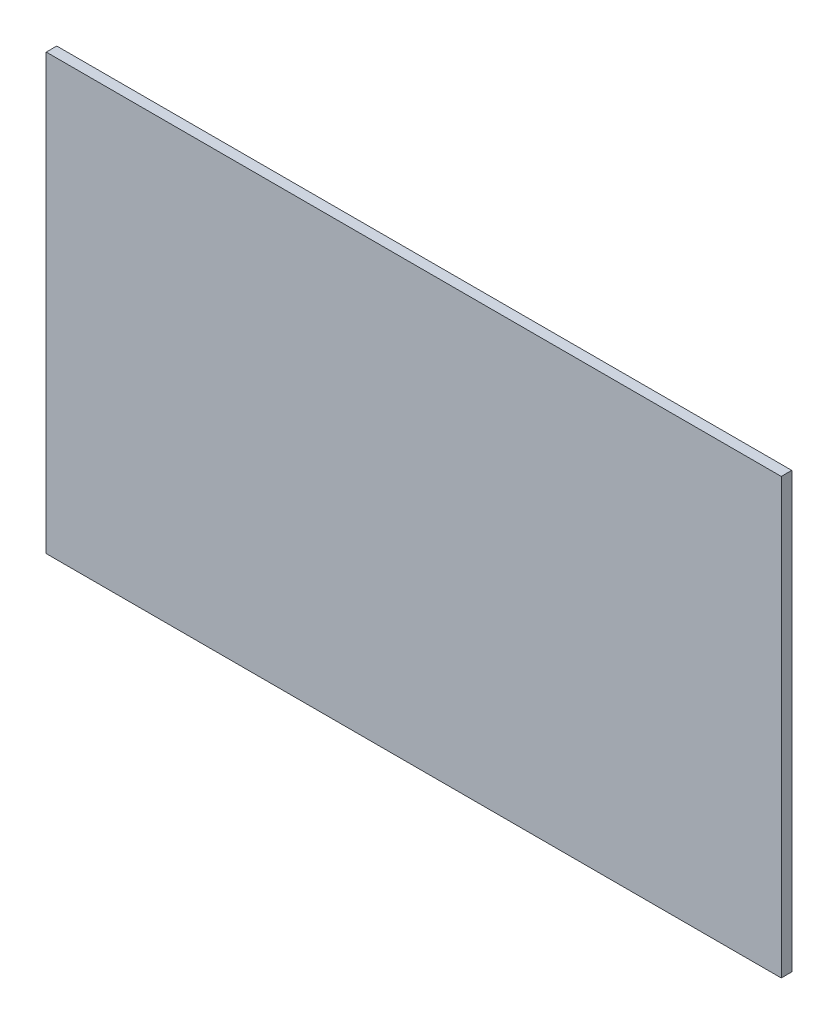
ISO-10303-21;
HEADER;
FILE_DESCRIPTION(('STEP AP214'),'2;1');
FILE_NAME('part.step','',(''),(''),'','','');
FILE_SCHEMA(('AUTOMOTIVE_DESIGN { 1 0 10303 214 1 1 1 1 }'));
ENDSEC;
DATA;
#1=APPLICATION_CONTEXT('core data for automotive mechanical design processes');
#2=APPLICATION_PROTOCOL_DEFINITION('international standard','automotive_design',2000,#1);
#3=PRODUCT_CONTEXT('',#1,'mechanical');
#4=PRODUCT('Part','Part','',(#3));
#5=PRODUCT_RELATED_PRODUCT_CATEGORY('part','',(#4));
#6=PRODUCT_DEFINITION_FORMATION('','',#4);
#7=PRODUCT_DEFINITION_CONTEXT('part definition',#1,'design');
#8=PRODUCT_DEFINITION('design','',#6,#7);
#9=PRODUCT_DEFINITION_SHAPE('','',#8);
#10=(LENGTH_UNIT() NAMED_UNIT(*) SI_UNIT(.MILLI.,.METRE.));
#11=(NAMED_UNIT(*) PLANE_ANGLE_UNIT() SI_UNIT($,.RADIAN.));
#12=(NAMED_UNIT(*) SI_UNIT($,.STERADIAN.) SOLID_ANGLE_UNIT());
#13=UNCERTAINTY_MEASURE_WITH_UNIT(LENGTH_MEASURE(1.E-05),#10,'distance_accuracy_value','');
#14=(GEOMETRIC_REPRESENTATION_CONTEXT(3) GLOBAL_UNCERTAINTY_ASSIGNED_CONTEXT((#13)) GLOBAL_UNIT_ASSIGNED_CONTEXT((#10,
#11,#12)) REPRESENTATION_CONTEXT('',''));
#15=CARTESIAN_POINT('',(0.,0.,0.));
#16=DIRECTION('',(0.,0.,1.));
#17=DIRECTION('',(1.,0.,0.));
#18=AXIS2_PLACEMENT_3D('',#15,#16,#17);
#19=CARTESIAN_POINT('',(88.9,52.5399,2.54));
#20=DIRECTION('',(-1.,0.,0.));
#21=DIRECTION('',(0.,0.,1.));
#22=AXIS2_PLACEMENT_3D('',#19,#20,#21);
#23=PLANE('',#22);
#24=DIRECTION('',(0.,1.,0.));
#25=VECTOR('',#24,1.);
#26=CARTESIAN_POINT('',(88.9,52.5399,0.));
#27=LINE('',#26,#25);
#28=CARTESIAN_POINT('',(88.9,-52.5399,0.));
#29=VERTEX_POINT('',#28);
#30=CARTESIAN_POINT('',(88.9,52.5399,0.));
#31=VERTEX_POINT('',#30);
#32=EDGE_CURVE('E107',#29,#31,#27,.T.);
#33=ORIENTED_EDGE('',*,*,#32,.T.);
#34=DIRECTION('',(0.,0.,-1.));
#35=VECTOR('',#34,1.);
#36=CARTESIAN_POINT('',(88.9,52.5399,2.54));
#37=LINE('',#36,#35);
#38=CARTESIAN_POINT('',(88.9,52.5399,2.54));
#39=VERTEX_POINT('',#38);
#40=EDGE_CURVE('E11',#39,#31,#37,.T.);
#41=ORIENTED_EDGE('',*,*,#40,.F.);
#42=DIRECTION('',(0.,1.,0.));
#43=VECTOR('',#42,1.);
#44=CARTESIAN_POINT('',(88.9,52.5399,2.54));
#45=LINE('',#44,#43);
#46=CARTESIAN_POINT('',(88.9,-52.5399,2.54));
#47=VERTEX_POINT('',#46);
#48=EDGE_CURVE('E91',#47,#39,#45,.T.);
#49=ORIENTED_EDGE('',*,*,#48,.F.);
#50=DIRECTION('',(0.,0.,-1.));
#51=VECTOR('',#50,1.);
#52=CARTESIAN_POINT('',(88.9,-52.5399,2.54));
#53=LINE('',#52,#51);
#54=EDGE_CURVE('E103',#47,#29,#53,.T.);
#55=ORIENTED_EDGE('',*,*,#54,.T.);
#56=EDGE_LOOP('',(#33,#41,#49,#55));
#57=FACE_BOUND('',#56,.T.);
#58=ADVANCED_FACE('F39',(#57),#23,.F.);
#59=CARTESIAN_POINT('',(-88.9,52.5399,2.54));
#60=DIRECTION('',(0.,-1.,0.));
#61=DIRECTION('',(1.,0.,0.));
#62=AXIS2_PLACEMENT_3D('',#59,#60,#61);
#63=PLANE('',#62);
#64=DIRECTION('',(-1.,0.,0.));
#65=VECTOR('',#64,1.);
#66=CARTESIAN_POINT('',(-88.9,52.5399,0.));
#67=LINE('',#66,#65);
#68=CARTESIAN_POINT('',(-88.9,52.5399,0.));
#69=VERTEX_POINT('',#68);
#70=EDGE_CURVE('E96',#31,#69,#67,.T.);
#71=ORIENTED_EDGE('',*,*,#70,.T.);
#72=DIRECTION('',(0.,0.,-1.));
#73=VECTOR('',#72,1.);
#74=CARTESIAN_POINT('',(-88.9,52.5399,2.54));
#75=LINE('',#74,#73);
#76=CARTESIAN_POINT('',(-88.9,52.5399,2.54));
#77=VERTEX_POINT('',#76);
#78=EDGE_CURVE('E48',#77,#69,#75,.T.);
#79=ORIENTED_EDGE('',*,*,#78,.F.);
#80=DIRECTION('',(-1.,0.,0.));
#81=VECTOR('',#80,1.);
#82=CARTESIAN_POINT('',(-88.9,52.5399,2.54));
#83=LINE('',#82,#81);
#84=EDGE_CURVE('E86',#39,#77,#83,.T.);
#85=ORIENTED_EDGE('',*,*,#84,.F.);
#86=ORIENTED_EDGE('',*,*,#40,.T.);
#87=EDGE_LOOP('',(#71,#79,#85,#86));
#88=FACE_BOUND('',#87,.T.);
#89=ADVANCED_FACE('F95',(#88),#63,.F.);
#90=CARTESIAN_POINT('',(-88.9,52.5399,2.54));
#91=DIRECTION('',(1.,0.,0.));
#92=DIRECTION('',(0.,1.,0.));
#93=AXIS2_PLACEMENT_3D('',#90,#91,#92);
#94=PLANE('',#93);
#95=DIRECTION('',(0.,-1.,0.));
#96=VECTOR('',#95,1.);
#97=CARTESIAN_POINT('',(-88.9,52.5399,0.));
#98=LINE('',#97,#96);
#99=CARTESIAN_POINT('',(-88.8999999999999,-52.5399,0.));
#100=VERTEX_POINT('',#99);
#101=EDGE_CURVE('E73',#69,#100,#98,.T.);
#102=ORIENTED_EDGE('',*,*,#101,.T.);
#103=DIRECTION('',(0.,0.,-1.));
#104=VECTOR('',#103,1.);
#105=CARTESIAN_POINT('',(-88.8999999999999,-52.5399,2.54));
#106=LINE('',#105,#104);
#107=CARTESIAN_POINT('',(-88.8999999999999,-52.5399,2.54));
#108=VERTEX_POINT('',#107);
#109=EDGE_CURVE('E98',#108,#100,#106,.T.);
#110=ORIENTED_EDGE('',*,*,#109,.F.);
#111=DIRECTION('',(0.,-1.,0.));
#112=VECTOR('',#111,1.);
#113=CARTESIAN_POINT('',(-88.9,52.5399,2.54));
#114=LINE('',#113,#112);
#115=EDGE_CURVE('E89',#77,#108,#114,.T.);
#116=ORIENTED_EDGE('',*,*,#115,.F.);
#117=ORIENTED_EDGE('',*,*,#78,.T.);
#118=EDGE_LOOP('',(#102,#110,#116,#117));
#119=FACE_BOUND('',#118,.T.);
#120=ADVANCED_FACE('F99',(#119),#94,.F.);
#121=CARTESIAN_POINT('',(-88.8999999999999,-52.5399,2.54));
#122=DIRECTION('',(0.,1.,0.));
#123=DIRECTION('',(0.,0.,1.));
#124=AXIS2_PLACEMENT_3D('',#121,#122,#123);
#125=PLANE('',#124);
#126=DIRECTION('',(1.,0.,0.));
#127=VECTOR('',#126,1.);
#128=CARTESIAN_POINT('',(-88.8999999999999,-52.5399,0.));
#129=LINE('',#128,#127);
#130=EDGE_CURVE('E79',#100,#29,#129,.T.);
#131=ORIENTED_EDGE('',*,*,#130,.T.);
#132=ORIENTED_EDGE('',*,*,#54,.F.);
#133=DIRECTION('',(1.,0.,0.));
#134=VECTOR('',#133,1.);
#135=CARTESIAN_POINT('',(-88.8999999999999,-52.5399,2.54));
#136=LINE('',#135,#134);
#137=EDGE_CURVE('E56',#108,#47,#136,.T.);
#138=ORIENTED_EDGE('',*,*,#137,.F.);
#139=ORIENTED_EDGE('',*,*,#109,.T.);
#140=EDGE_LOOP('',(#131,#132,#138,#139));
#141=FACE_BOUND('',#140,.T.);
#142=ADVANCED_FACE('F120',(#141),#125,.F.);
#143=CARTESIAN_POINT('',(0.,0.,2.54));
#144=DIRECTION('',(0.,0.,1.));
#145=DIRECTION('',(1.,0.,0.));
#146=AXIS2_PLACEMENT_3D('',#143,#144,#145);
#147=PLANE('',#146);
#148=ORIENTED_EDGE('',*,*,#48,.T.);
#149=ORIENTED_EDGE('',*,*,#84,.T.);
#150=ORIENTED_EDGE('',*,*,#115,.T.);
#151=ORIENTED_EDGE('',*,*,#137,.T.);
#152=EDGE_LOOP('',(#148,#149,#150,#151));
#153=FACE_BOUND('',#152,.T.);
#154=ADVANCED_FACE('F87',(#153),#147,.T.);
#155=CARTESIAN_POINT('',(0.,0.,0.));
#156=DIRECTION('',(0.,0.,1.));
#157=DIRECTION('',(1.,0.,0.));
#158=AXIS2_PLACEMENT_3D('',#155,#156,#157);
#159=PLANE('',#158);
#160=ORIENTED_EDGE('',*,*,#32,.F.);
#161=ORIENTED_EDGE('',*,*,#130,.F.);
#162=ORIENTED_EDGE('',*,*,#101,.F.);
#163=ORIENTED_EDGE('',*,*,#70,.F.);
#164=EDGE_LOOP('',(#160,#161,#162,#163));
#165=FACE_BOUND('',#164,.T.);
#166=ADVANCED_FACE('F123',(#165),#159,.F.);
#167=CLOSED_SHELL('',(#58,#89,#120,#142,#154,#166));
#168=MANIFOLD_SOLID_BREP('B2',#167);
#169=ADVANCED_BREP_SHAPE_REPRESENTATION('',(#18,#168),#14);
#170=SHAPE_DEFINITION_REPRESENTATION(#9,#169);
ENDSEC;
END-ISO-10303-21;
